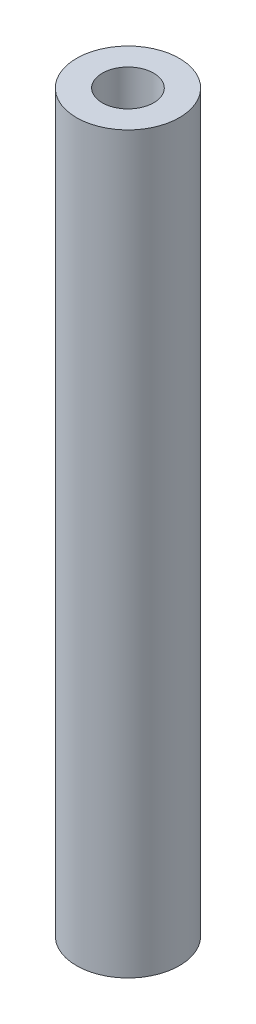
ISO-10303-21;
HEADER;
FILE_DESCRIPTION(('STEP AP214'),'2;1');
FILE_NAME('part.step','',(''),(''),'','','');
FILE_SCHEMA(('AUTOMOTIVE_DESIGN { 1 0 10303 214 1 1 1 1 }'));
ENDSEC;
DATA;
#1=APPLICATION_CONTEXT('core data for automotive mechanical design processes');
#2=APPLICATION_PROTOCOL_DEFINITION('international standard','automotive_design',2000,#1);
#3=PRODUCT_CONTEXT('',#1,'mechanical');
#4=PRODUCT('Part','Part','',(#3));
#5=PRODUCT_RELATED_PRODUCT_CATEGORY('part','',(#4));
#6=PRODUCT_DEFINITION_FORMATION('','',#4);
#7=PRODUCT_DEFINITION_CONTEXT('part definition',#1,'design');
#8=PRODUCT_DEFINITION('design','',#6,#7);
#9=PRODUCT_DEFINITION_SHAPE('','',#8);
#10=(LENGTH_UNIT() NAMED_UNIT(*) SI_UNIT(.MILLI.,.METRE.));
#11=(NAMED_UNIT(*) PLANE_ANGLE_UNIT() SI_UNIT($,.RADIAN.));
#12=(NAMED_UNIT(*) SI_UNIT($,.STERADIAN.) SOLID_ANGLE_UNIT());
#13=UNCERTAINTY_MEASURE_WITH_UNIT(LENGTH_MEASURE(1.E-05),#10,'distance_accuracy_value','');
#14=(GEOMETRIC_REPRESENTATION_CONTEXT(3) GLOBAL_UNCERTAINTY_ASSIGNED_CONTEXT((#13)) GLOBAL_UNIT_ASSIGNED_CONTEXT((#10,
#11,#12)) REPRESENTATION_CONTEXT('',''));
#15=CARTESIAN_POINT('',(0.,0.,0.));
#16=DIRECTION('',(0.,0.,1.));
#17=DIRECTION('',(1.,0.,0.));
#18=AXIS2_PLACEMENT_3D('',#15,#16,#17);
#19=CARTESIAN_POINT('',(0.,50.,0.));
#20=DIRECTION('',(0.,1.,0.));
#21=DIRECTION('',(0.,0.,1.));
#22=AXIS2_PLACEMENT_3D('',#19,#20,#21);
#23=PLANE('',#22);
#24=CARTESIAN_POINT('',(0.,50.,0.));
#25=DIRECTION('',(0.,1.,0.));
#26=DIRECTION('',(0.,0.,1.));
#27=AXIS2_PLACEMENT_3D('',#24,#25,#26);
#28=CIRCLE('',#27,3.5);
#29=CARTESIAN_POINT('',(0.,50.,3.5));
#30=VERTEX_POINT('',#29);
#31=EDGE_CURVE('E10',#30,#30,#28,.T.);
#32=ORIENTED_EDGE('',*,*,#31,.T.);
#33=EDGE_LOOP('',(#32));
#34=FACE_BOUND('',#33,.T.);
#35=CARTESIAN_POINT('',(0.,50.,0.));
#36=DIRECTION('',(0.,1.,0.));
#37=DIRECTION('',(0.,0.,1.));
#38=AXIS2_PLACEMENT_3D('',#35,#36,#37);
#39=CIRCLE('',#38,1.75);
#40=CARTESIAN_POINT('',(0.,50.,1.75));
#41=VERTEX_POINT('',#40);
#42=EDGE_CURVE('E43',#41,#41,#39,.T.);
#43=ORIENTED_EDGE('',*,*,#42,.F.);
#44=EDGE_LOOP('',(#43));
#45=FACE_BOUND('',#44,.T.);
#46=ADVANCED_FACE('F32',(#34,#45),#23,.T.);
#47=CARTESIAN_POINT('',(0.,0.,0.));
#48=DIRECTION('',(0.,1.,0.));
#49=DIRECTION('',(0.,0.,1.));
#50=AXIS2_PLACEMENT_3D('',#47,#48,#49);
#51=PLANE('',#50);
#52=CARTESIAN_POINT('',(0.,0.,0.));
#53=DIRECTION('',(0.,1.,0.));
#54=DIRECTION('',(0.,0.,1.));
#55=AXIS2_PLACEMENT_3D('',#52,#53,#54);
#56=CIRCLE('',#55,3.5);
#57=CARTESIAN_POINT('',(0.,0.,3.5));
#58=VERTEX_POINT('',#57);
#59=EDGE_CURVE('E36',#58,#58,#56,.T.);
#60=ORIENTED_EDGE('',*,*,#59,.F.);
#61=EDGE_LOOP('',(#60));
#62=FACE_BOUND('',#61,.T.);
#63=CARTESIAN_POINT('',(0.,0.,0.));
#64=DIRECTION('',(0.,1.,0.));
#65=DIRECTION('',(0.,0.,1.));
#66=AXIS2_PLACEMENT_3D('',#63,#64,#65);
#67=CIRCLE('',#66,1.75);
#68=CARTESIAN_POINT('',(0.,0.,1.75));
#69=VERTEX_POINT('',#68);
#70=EDGE_CURVE('E45',#69,#69,#67,.T.);
#71=ORIENTED_EDGE('',*,*,#70,.T.);
#72=EDGE_LOOP('',(#71));
#73=FACE_BOUND('',#72,.T.);
#74=ADVANCED_FACE('F55',(#62,#73),#51,.F.);
#75=CARTESIAN_POINT('',(0.,50.,0.));
#76=DIRECTION('',(0.,-1.,0.));
#77=DIRECTION('',(0.,0.,-1.));
#78=AXIS2_PLACEMENT_3D('',#75,#76,#77);
#79=CYLINDRICAL_SURFACE('',#78,3.5);
#80=ORIENTED_EDGE('',*,*,#31,.F.);
#81=EDGE_LOOP('',(#80));
#82=FACE_BOUND('',#81,.T.);
#83=ORIENTED_EDGE('',*,*,#59,.T.);
#84=EDGE_LOOP('',(#83));
#85=FACE_BOUND('',#84,.T.);
#86=ADVANCED_FACE('F34',(#82,#85),#79,.T.);
#87=CARTESIAN_POINT('',(0.,50.,0.));
#88=DIRECTION('',(0.,-1.,0.));
#89=DIRECTION('',(0.,0.,-1.));
#90=AXIS2_PLACEMENT_3D('',#87,#88,#89);
#91=CYLINDRICAL_SURFACE('',#90,1.75);
#92=ORIENTED_EDGE('',*,*,#42,.T.);
#93=EDGE_LOOP('',(#92));
#94=FACE_BOUND('',#93,.T.);
#95=ORIENTED_EDGE('',*,*,#70,.F.);
#96=EDGE_LOOP('',(#95));
#97=FACE_BOUND('',#96,.T.);
#98=ADVANCED_FACE('F51',(#94,#97),#91,.F.);
#99=CLOSED_SHELL('',(#46,#74,#86,#98));
#100=MANIFOLD_SOLID_BREP('B2',#99);
#101=ADVANCED_BREP_SHAPE_REPRESENTATION('',(#18,#100),#14);
#102=SHAPE_DEFINITION_REPRESENTATION(#9,#101);
ENDSEC;
END-ISO-10303-21;
